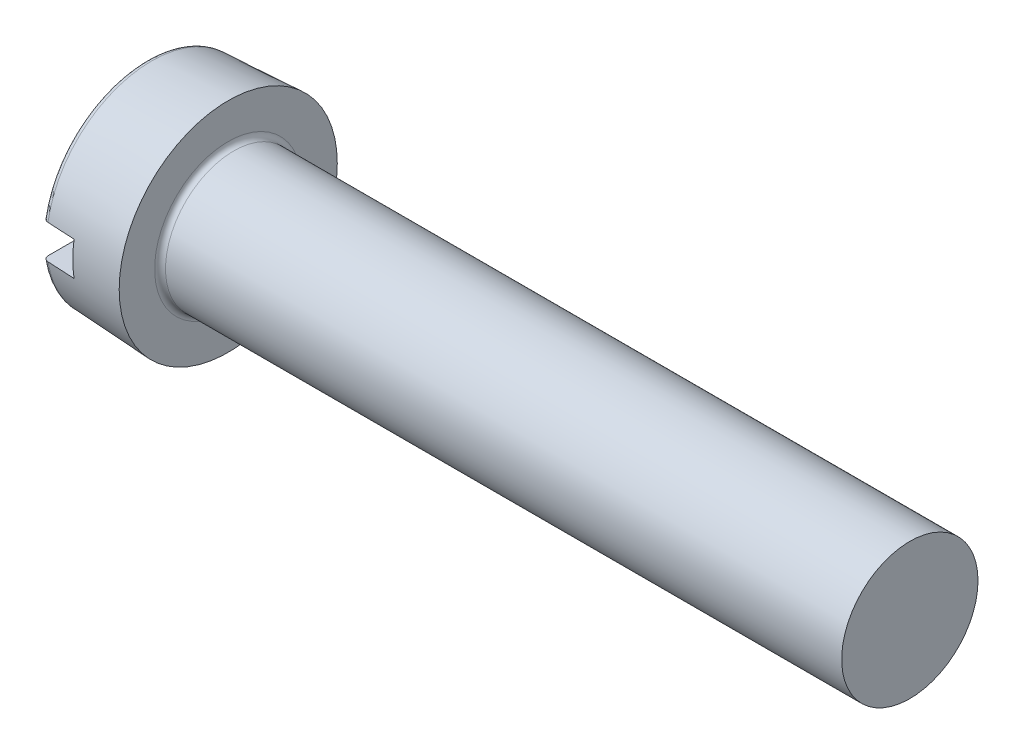
ISO-10303-21;
HEADER;
FILE_DESCRIPTION(('STEP AP214'),'2;1');
FILE_NAME('part.step','',(''),(''),'','','');
FILE_SCHEMA(('AUTOMOTIVE_DESIGN { 1 0 10303 214 1 1 1 1 }'));
ENDSEC;
DATA;
#1=APPLICATION_CONTEXT('core data for automotive mechanical design processes');
#2=APPLICATION_PROTOCOL_DEFINITION('international standard','automotive_design',2000,#1);
#3=PRODUCT_CONTEXT('',#1,'mechanical');
#4=PRODUCT('Part','Part','',(#3));
#5=PRODUCT_RELATED_PRODUCT_CATEGORY('part','',(#4));
#6=PRODUCT_DEFINITION_FORMATION('','',#4);
#7=PRODUCT_DEFINITION_CONTEXT('part definition',#1,'design');
#8=PRODUCT_DEFINITION('design','',#6,#7);
#9=PRODUCT_DEFINITION_SHAPE('','',#8);
#10=(LENGTH_UNIT() NAMED_UNIT(*) SI_UNIT(.MILLI.,.METRE.));
#11=(NAMED_UNIT(*) PLANE_ANGLE_UNIT() SI_UNIT($,.RADIAN.));
#12=(NAMED_UNIT(*) SI_UNIT($,.STERADIAN.) SOLID_ANGLE_UNIT());
#13=UNCERTAINTY_MEASURE_WITH_UNIT(LENGTH_MEASURE(1.E-05),#10,'distance_accuracy_value','');
#14=(GEOMETRIC_REPRESENTATION_CONTEXT(3) GLOBAL_UNCERTAINTY_ASSIGNED_CONTEXT((#13)) GLOBAL_UNIT_ASSIGNED_CONTEXT((#10,
#11,#12)) REPRESENTATION_CONTEXT('',''));
#15=CARTESIAN_POINT('',(0.,0.,0.));
#16=DIRECTION('',(0.,0.,1.));
#17=DIRECTION('',(1.,0.,0.));
#18=AXIS2_PLACEMENT_3D('',#15,#16,#17);
#19=CARTESIAN_POINT('',(-5.68076434205211,-1.62548997138856,2.70142219270042));
#20=DIRECTION('',(1.,0.,0.));
#21=DIRECTION('',(0.,0.,-1.));
#22=AXIS2_PLACEMENT_3D('',#19,#20,#21);
#23=PLANE('',#22);
#24=DIRECTION('',(0.,0.,-1.));
#25=VECTOR('',#24,1.);
#26=CARTESIAN_POINT('',(-5.68076434205211,-2.87548997138856,2.70142219270042));
#27=LINE('',#26,#25);
#28=CARTESIAN_POINT('',(-5.68076434205211,-2.87548997138856,9.89966233013808));
#29=VERTEX_POINT('',#28);
#30=CARTESIAN_POINT('',(-5.68076434205211,-2.87548997138856,-4.49681794473724));
#31=VERTEX_POINT('',#30);
#32=EDGE_CURVE('E96',#29,#31,#27,.T.);
#33=ORIENTED_EDGE('',*,*,#32,.T.);
#34=CARTESIAN_POINT('',(-5.68076434205211,-1.62548997138856,2.70142219270042));
#35=DIRECTION('',(1.,0.,0.));
#36=DIRECTION('',(0.,0.,-1.));
#37=AXIS2_PLACEMENT_3D('',#34,#35,#36);
#38=CIRCLE('',#37,7.3059674976158);
#39=EDGE_CURVE('E184',#31,#29,#38,.F.);
#40=ORIENTED_EDGE('',*,*,#39,.T.);
#41=EDGE_LOOP('',(#33,#40));
#42=FACE_BOUND('',#41,.T.);
#43=ADVANCED_FACE('F16',(#42),#23,.F.);
#44=CARTESIAN_POINT('',(0.319235657947887,-1.62548997138856,2.70142219270042));
#45=DIRECTION('',(1.,0.,0.));
#46=DIRECTION('',(0.,0.,-1.));
#47=AXIS2_PLACEMENT_3D('',#44,#45,#46);
#48=PLANE('',#47);
#49=CARTESIAN_POINT('',(0.319235657947887,-1.62548997138856,2.70142219270042));
#50=DIRECTION('',(1.,0.,0.));
#51=DIRECTION('',(0.,0.,-1.));
#52=AXIS2_PLACEMENT_3D('',#49,#50,#51);
#53=CIRCLE('',#52,5.4);
#54=CARTESIAN_POINT('',(0.319235657947887,-1.62548997138856,-2.69857780729958));
#55=VERTEX_POINT('',#54);
#56=EDGE_CURVE('E106',#55,#55,#53,.F.);
#57=ORIENTED_EDGE('',*,*,#56,.T.);
#58=EDGE_LOOP('',(#57));
#59=FACE_BOUND('',#58,.T.);
#60=CARTESIAN_POINT('',(0.319235657947887,-1.62548997138856,2.70142219270042));
#61=DIRECTION('',(1.,0.,0.));
#62=DIRECTION('',(0.,0.,-1.));
#63=AXIS2_PLACEMENT_3D('',#60,#61,#62);
#64=CIRCLE('',#63,8.);
#65=CARTESIAN_POINT('',(0.319235657947887,-1.62548997138856,-5.29857780729958));
#66=VERTEX_POINT('',#65);
#67=EDGE_CURVE('E213',#66,#66,#64,.T.);
#68=ORIENTED_EDGE('',*,*,#67,.T.);
#69=EDGE_LOOP('',(#68));
#70=FACE_BOUND('',#69,.T.);
#71=ADVANCED_FACE('F157',(#59,#70),#48,.T.);
#72=CARTESIAN_POINT('',(0.319235657947887,-1.62548997138856,2.70142219270042));
#73=DIRECTION('',(1.,0.,0.));
#74=DIRECTION('',(0.,0.,-1.));
#75=AXIS2_PLACEMENT_3D('',#72,#73,#74);
#76=CONICAL_SURFACE('',#75,8.,0.05235987755983);
#77=CARTESIAN_POINT('',(-19.2653061007865,-2.87548997138856,9.56209586531042));
#78=CARTESIAN_POINT('',(-16.8158751824795,-2.87548997138856,9.69257714206704));
#79=CARTESIAN_POINT('',(-14.3664380480004,-2.87548997138856,9.82294167347964));
#80=CARTESIAN_POINT('',(-9.46755301818584,-2.87548997138856,10.083468164128));
#81=CARTESIAN_POINT('',(-7.0181051228504,-2.87548997138856,10.2136301233648));
#82=CARTESIAN_POINT('',(-2.11920022133507,-2.87548997138856,10.4737823893166));
#83=CARTESIAN_POINT('',(0.330256784844802,-2.87548997138856,10.6037726960318));
#84=CARTESIAN_POINT('',(5.22917871232099,-2.87548997138856,10.8636043159814));
#85=CARTESIAN_POINT('',(7.67864363361735,-2.87548997138856,10.9934456292149));
#86=CARTESIAN_POINT('',(10.1281119004095,-2.87548997138856,11.1232237744742));
#87=B_SPLINE_CURVE_WITH_KNOTS('',3,(#77,#78,#79,#80,#81,#82,#83,#84,#85,#86),.UNSPECIFIED.,.F.,
.F.,(4,2,2,2,4),(0.,7.35871147572517,14.7174229139558,22.0761343417157,29.4348458068954),.UNSPECIFIED.);
#88=CARTESIAN_POINT('',(-5.30169872454929,-2.87548997138856,10.3047758452875));
#89=VERTEX_POINT('',#88);
#90=CARTESIAN_POINT('',(-3.28076434205211,-2.87548997138856,10.412090615708));
#91=VERTEX_POINT('',#90);
#92=EDGE_CURVE('E80',#89,#91,#87,.T.);
#93=ORIENTED_EDGE('',*,*,#92,.F.);
#94=CARTESIAN_POINT('',(-5.30169872454929,-1.62548997138856,2.70142219270042));
#95=DIRECTION('',(1.,0.,0.));
#96=DIRECTION('',(0.,0.,-1.));
#97=AXIS2_PLACEMENT_3D('',#94,#95,#96);
#98=CIRCLE('',#97,7.70541931151763);
#99=CARTESIAN_POINT('',(-5.30169872454929,-2.87548997138856,-4.90193145988664));
#100=VERTEX_POINT('',#99);
#101=EDGE_CURVE('E112',#89,#100,#98,.T.);
#102=ORIENTED_EDGE('',*,*,#101,.T.);
#103=CARTESIAN_POINT('',(10.1281119004095,-2.87548997138856,-5.72037938907336));
#104=CARTESIAN_POINT('',(7.67864363361735,-2.87548997138856,-5.59060124381403));
#105=CARTESIAN_POINT('',(5.22917871232099,-2.87548997138856,-5.46075993058053));
#106=CARTESIAN_POINT('',(0.3302567848448,-2.87548997138856,-5.200928310631));
#107=CARTESIAN_POINT('',(-2.11920022133507,-2.87548997138856,-5.07093800391572));
#108=CARTESIAN_POINT('',(-7.0181051228504,-2.87548997138856,-4.81078573796391));
#109=CARTESIAN_POINT('',(-9.46755301818584,-2.87548997138856,-4.68062377872714));
#110=CARTESIAN_POINT('',(-14.3664380480004,-2.87548997138856,-4.4200972880788));
#111=CARTESIAN_POINT('',(-16.8158751824795,-2.87548997138856,-4.2897327566662));
#112=CARTESIAN_POINT('',(-19.2653061007865,-2.87548997138856,-4.15925147990958));
#113=B_SPLINE_CURVE_WITH_KNOTS('',3,(#103,#104,#105,#106,#107,#108,#109,#110,#111,#112),
.UNSPECIFIED.,.F.,.F.,(4,2,2,2,4),(0.,7.35871146517972,14.7174228929396,22.0761343311703,
29.4348458068954),.UNSPECIFIED.);
#114=CARTESIAN_POINT('',(-3.28076434205211,-2.87548997138856,-5.00924623030712));
#115=VERTEX_POINT('',#114);
#116=EDGE_CURVE('E92',#115,#100,#113,.T.);
#117=ORIENTED_EDGE('',*,*,#116,.F.);
#118=CARTESIAN_POINT('',(-3.28076434205211,-1.62548997138856,2.70142219270042));
#119=DIRECTION('',(1.,0.,0.));
#120=DIRECTION('',(0.,0.,-1.));
#121=AXIS2_PLACEMENT_3D('',#118,#119,#120);
#122=CIRCLE('',#121,7.81133199458105);
#123=CARTESIAN_POINT('',(-3.28076434205211,-0.375489971388559,-5.00924623030712));
#124=VERTEX_POINT('',#123);
#125=EDGE_CURVE('E84',#124,#115,#122,.F.);
#126=ORIENTED_EDGE('',*,*,#125,.F.);
#127=CARTESIAN_POINT('',(-19.2653061007865,-0.375489971388567,-4.15925147990958));
#128=CARTESIAN_POINT('',(-16.8158751824795,-0.375489971388566,-4.2897327566662));
#129=CARTESIAN_POINT('',(-14.3664380480004,-0.375489971388565,-4.42009728807881));
#130=CARTESIAN_POINT('',(-9.46755301818584,-0.375489971388562,-4.68062377872714));
#131=CARTESIAN_POINT('',(-7.0181051228504,-0.375489971388561,-4.81078573796391));
#132=CARTESIAN_POINT('',(-2.11920022133507,-0.375489971388558,-5.07093800391572));
#133=CARTESIAN_POINT('',(0.3302567848448,-0.375489971388557,-5.200928310631));
#134=CARTESIAN_POINT('',(5.229178712321,-0.375489971388554,-5.46075993058053));
#135=CARTESIAN_POINT('',(7.67864363361736,-0.375489971388553,-5.59060124381403));
#136=CARTESIAN_POINT('',(10.1281119004095,-0.375489971388551,-5.72037938907336));
#137=B_SPLINE_CURVE_WITH_KNOTS('',3,(#127,#128,#129,#130,#131,#132,#133,#134,#135,#136),
.UNSPECIFIED.,.F.,.F.,(4,2,2,2,4),(0.,7.35871147572517,14.7174229139558,22.0761343417157,
29.4348458068954),.UNSPECIFIED.);
#138=CARTESIAN_POINT('',(-5.30169872454929,-0.37548997138856,-4.90193145988664));
#139=VERTEX_POINT('',#138);
#140=EDGE_CURVE('E68',#139,#124,#137,.T.);
#141=ORIENTED_EDGE('',*,*,#140,.F.);
#142=CARTESIAN_POINT('',(-5.30169872454929,-1.62548997138856,2.70142219270042));
#143=DIRECTION('',(1.,0.,0.));
#144=DIRECTION('',(0.,0.,-1.));
#145=AXIS2_PLACEMENT_3D('',#142,#143,#144);
#146=CIRCLE('',#145,7.70541931151763);
#147=CARTESIAN_POINT('',(-5.30169872454929,-0.37548997138856,10.3047758452875));
#148=VERTEX_POINT('',#147);
#149=EDGE_CURVE('E108',#139,#148,#146,.T.);
#150=ORIENTED_EDGE('',*,*,#149,.T.);
#151=CARTESIAN_POINT('',(10.1281119004095,-0.375489971388551,11.1232237744742));
#152=CARTESIAN_POINT('',(7.67864363361735,-0.375489971388553,10.9934456292149));
#153=CARTESIAN_POINT('',(5.22917871232099,-0.375489971388554,10.8636043159814));
#154=CARTESIAN_POINT('',(0.3302567848448,-0.375489971388557,10.6037726960318));
#155=CARTESIAN_POINT('',(-2.11920022133507,-0.375489971388558,10.4737823893166));
#156=CARTESIAN_POINT('',(-7.0181051228504,-0.375489971388561,10.2136301233648));
#157=CARTESIAN_POINT('',(-9.46755301818584,-0.375489971388562,10.083468164128));
#158=CARTESIAN_POINT('',(-14.3664380480004,-0.375489971388565,9.82294167347965));
#159=CARTESIAN_POINT('',(-16.8158751824795,-0.375489971388566,9.69257714206704));
#160=CARTESIAN_POINT('',(-19.2653061007865,-0.375489971388567,9.56209586531042));
#161=B_SPLINE_CURVE_WITH_KNOTS('',3,(#151,#152,#153,#154,#155,#156,#157,#158,#159,#160),
.UNSPECIFIED.,.F.,.F.,(4,2,2,2,4),(0.,7.35871146517972,14.7174228929396,22.0761343311703,
29.4348458068954),.UNSPECIFIED.);
#162=CARTESIAN_POINT('',(-3.28076434205211,-0.375489971388559,10.412090615708));
#163=VERTEX_POINT('',#162);
#164=EDGE_CURVE('E77',#163,#148,#161,.T.);
#165=ORIENTED_EDGE('',*,*,#164,.F.);
#166=EDGE_CURVE('E88',#91,#163,#122,.F.);
#167=ORIENTED_EDGE('',*,*,#166,.F.);
#168=EDGE_LOOP('',(#93,#102,#117,#126,#141,#150,#165,#167));
#169=FACE_BOUND('',#168,.T.);
#170=ORIENTED_EDGE('',*,*,#67,.F.);
#171=EDGE_LOOP('',(#170));
#172=FACE_BOUND('',#171,.T.);
#173=ADVANCED_FACE('F93',(#169,#172),#76,.T.);
#174=DIRECTION('',(0.,0.,1.));
#175=VECTOR('',#174,1.);
#176=CARTESIAN_POINT('',(-5.68076434205211,-0.37548997138856,2.70142219270042));
#177=LINE('',#176,#175);
#178=CARTESIAN_POINT('',(-5.68076434205211,-0.37548997138856,-4.49681794473724));
#179=VERTEX_POINT('',#178);
#180=CARTESIAN_POINT('',(-5.68076434205211,-0.37548997138856,9.89966233013808));
#181=VERTEX_POINT('',#180);
#182=EDGE_CURVE('E99',#179,#181,#177,.T.);
#183=ORIENTED_EDGE('',*,*,#182,.T.);
#184=CARTESIAN_POINT('',(-5.68076434205211,-1.62548997138856,2.70142219270042));
#185=DIRECTION('',(1.,0.,0.));
#186=DIRECTION('',(0.,0.,-1.));
#187=AXIS2_PLACEMENT_3D('',#184,#185,#186);
#188=CIRCLE('',#187,7.3059674976158);
#189=EDGE_CURVE('E10',#181,#179,#188,.F.);
#190=ORIENTED_EDGE('',*,*,#189,.T.);
#191=EDGE_LOOP('',(#183,#190));
#192=FACE_BOUND('',#191,.T.);
#193=ADVANCED_FACE('F158',(#192),#23,.F.);
#194=CARTESIAN_POINT('',(50.319235657857,-1.62548997138856,2.70142219270042));
#195=DIRECTION('',(-1.,0.,0.));
#196=DIRECTION('',(0.,0.,1.));
#197=AXIS2_PLACEMENT_3D('',#194,#195,#196);
#198=CYLINDRICAL_SURFACE('',#197,5.);
#199=CARTESIAN_POINT('',(0.71923565794789,-1.62548997138856,2.70142219270042));
#200=DIRECTION('',(1.,0.,0.));
#201=DIRECTION('',(0.,0.,-1.));
#202=AXIS2_PLACEMENT_3D('',#199,#200,#201);
#203=CIRCLE('',#202,5.);
#204=CARTESIAN_POINT('',(0.71923565794789,-1.62548997138856,-2.29857780729958));
#205=VERTEX_POINT('',#204);
#206=EDGE_CURVE('E98',#205,#205,#203,.T.);
#207=ORIENTED_EDGE('',*,*,#206,.T.);
#208=EDGE_LOOP('',(#207));
#209=FACE_BOUND('',#208,.T.);
#210=CARTESIAN_POINT('',(50.319235657857,-1.62548997138856,2.70142219270042));
#211=DIRECTION('',(1.,0.,0.));
#212=DIRECTION('',(0.,0.,-1.));
#213=AXIS2_PLACEMENT_3D('',#210,#211,#212);
#214=CIRCLE('',#213,5.);
#215=CARTESIAN_POINT('',(50.319235657857,-1.62548997138856,-2.29857780729958));
#216=VERTEX_POINT('',#215);
#217=EDGE_CURVE('E153',#216,#216,#214,.T.);
#218=ORIENTED_EDGE('',*,*,#217,.F.);
#219=EDGE_LOOP('',(#218));
#220=FACE_BOUND('',#219,.T.);
#221=ADVANCED_FACE('F208',(#209,#220),#198,.T.);
#222=CARTESIAN_POINT('',(50.319235657857,-1.62548997138856,2.70142219270042));
#223=DIRECTION('',(1.,0.,0.));
#224=DIRECTION('',(0.,0.,-1.));
#225=AXIS2_PLACEMENT_3D('',#222,#223,#224);
#226=PLANE('',#225);
#227=ORIENTED_EDGE('',*,*,#217,.T.);
#228=EDGE_LOOP('',(#227));
#229=FACE_BOUND('',#228,.T.);
#230=ADVANCED_FACE('F133',(#229),#226,.T.);
#231=CARTESIAN_POINT('',(-5.68076434205211,-2.87548997138856,-5.29857780729958));
#232=DIRECTION('',(0.,-1.,0.));
#233=DIRECTION('',(1.,0.,0.));
#234=AXIS2_PLACEMENT_3D('',#231,#232,#233);
#235=PLANE('',#234);
#236=ORIENTED_EDGE('',*,*,#116,.T.);
#237=CARTESIAN_POINT('',(-5.30169872454929,-2.87548997138856,-4.90193145988663));
#238=CARTESIAN_POINT('',(-5.32397658899489,-2.87548997138856,-4.90076853134963));
#239=CARTESIAN_POINT('',(-5.34614424691299,-2.87548997138856,-4.89767846366656));
#240=CARTESIAN_POINT('',(-5.38962400834501,-2.87548997138856,-4.88783228872694));
#241=CARTESIAN_POINT('',(-5.41093707549727,-2.87548997138856,-4.88108044291219));
#242=CARTESIAN_POINT('',(-5.45213390241985,-2.87548997138856,-4.86409258614218));
#243=CARTESIAN_POINT('',(-5.47201718670741,-2.87548997138856,-4.85385542255487));
#244=CARTESIAN_POINT('',(-5.50979538711333,-2.87548997138856,-4.83021128874185));
#245=CARTESIAN_POINT('',(-5.52769048812116,-2.87548997138856,-4.81680461362556));
#246=CARTESIAN_POINT('',(-5.56111586966896,-2.87548997138856,-4.78711800664787));
#247=CARTESIAN_POINT('',(-5.57663051203876,-2.87548997138856,-4.77082047453877));
#248=CARTESIAN_POINT('',(-5.60475005472905,-2.87548997138856,-4.73587627936154));
#249=CARTESIAN_POINT('',(-5.61735400993793,-2.87548997138856,-4.71722885630393));
#250=CARTESIAN_POINT('',(-5.63946751461055,-2.87548997138856,-4.67785596397625));
#251=CARTESIAN_POINT('',(-5.64893354629003,-2.87548997138856,-4.65710609407139));
#252=CARTESIAN_POINT('',(-5.66428887540118,-2.87548997138856,-4.61433203581689));
#253=CARTESIAN_POINT('',(-5.67018098395311,-2.87548997138856,-4.59230886397583));
#254=CARTESIAN_POINT('',(-5.67639668829817,-2.87548997138856,-4.55789374402389));
#255=CARTESIAN_POINT('',(-5.67803493552397,-2.87548997138856,-4.54572492780513));
#256=CARTESIAN_POINT('',(-5.68021782620474,-2.87548997138856,-4.52131178461762));
#257=CARTESIAN_POINT('',(-5.68076444404134,-2.87548997138856,-4.5090676342254));
#258=CARTESIAN_POINT('',(-5.68076434205221,-2.87548997138856,-4.49681794473725));
#259=B_SPLINE_CURVE_WITH_KNOTS('',3,(#237,#238,#239,#240,#241,#242,#243,#244,#245,#246,#247,
#248,#249,#250,#251,#252,#253,#254,#255,#256,#257,#258),.UNSPECIFIED.,.F.,.F.,(4,2,2,2,2,2,2,2,
2,2,4),(0.,0.0668313746306013,0.133585139755698,0.200361002547336,0.267130650365643,
0.334321708472481,0.401534553201093,0.469643928473144,0.53769966163764,0.574492120019076,
0.611217973028153),.UNSPECIFIED.);
#260=EDGE_CURVE('E120',#100,#31,#259,.T.);
#261=ORIENTED_EDGE('',*,*,#260,.T.);
#262=ORIENTED_EDGE('',*,*,#32,.F.);
#263=CARTESIAN_POINT('',(-5.68076434205211,-2.87548997138856,9.89966233013808));
#264=CARTESIAN_POINT('',(-5.68078245571232,-2.87548997138856,9.92272891751978));
#265=CARTESIAN_POINT('',(-5.6788285099749,-2.87548997138856,9.94579224876267));
#266=CARTESIAN_POINT('',(-5.6711037557665,-2.87548997138856,9.99126399804459));
#267=CARTESIAN_POINT('',(-5.66533408422335,-2.87548997138856,10.013672609087));
#268=CARTESIAN_POINT('',(-5.65009995111816,-2.87548997138856,10.0572154365966));
#269=CARTESIAN_POINT('',(-5.64063304479067,-2.87548997138856,10.0783487991192));
#270=CARTESIAN_POINT('',(-5.61826382448252,-2.87548997138856,10.1187034540116));
#271=CARTESIAN_POINT('',(-5.60536270994631,-2.87548997138856,10.1379254107527));
#272=CARTESIAN_POINT('',(-5.57658191604202,-2.87548997138856,10.1737583751217));
#273=CARTESIAN_POINT('',(-5.56072505446732,-2.87548997138856,10.1903877025082));
#274=CARTESIAN_POINT('',(-5.52640408921236,-2.87548997138856,10.2207096421876));
#275=CARTESIAN_POINT('',(-5.50793922921896,-2.87548997138856,10.2344013996807));
#276=CARTESIAN_POINT('',(-5.46919513949327,-2.87548997138856,10.2582595409048));
#277=CARTESIAN_POINT('',(-5.44894287615049,-2.87548997138856,10.2684697978818));
#278=CARTESIAN_POINT('',(-5.40700798154731,-2.87548997138856,10.2852884173398));
#279=CARTESIAN_POINT('',(-5.38532711292057,-2.87548997138856,10.2919011285737));
#280=CARTESIAN_POINT('',(-5.35312058946873,-2.87548997138856,10.2987831018485));
#281=CARTESIAN_POINT('',(-5.34289513600565,-2.87548997138856,10.3005494376175));
#282=CARTESIAN_POINT('',(-5.32235479728201,-2.87548997138856,10.3032703663495));
#283=CARTESIAN_POINT('',(-5.31204009744075,-2.87548997138856,10.304226358977));
#284=CARTESIAN_POINT('',(-5.30169872454929,-2.87548997138856,10.3047758452875));
#285=B_SPLINE_CURVE_WITH_KNOTS('',3,(#263,#264,#265,#266,#267,#268,#269,#270,#271,#272,#273,
#274,#275,#276,#277,#278,#279,#280,#281,#282,#283,#284),.UNSPECIFIED.,.F.,.F.,(4,2,2,2,2,2,2,2,
2,2,4),(0.,0.0691128770525089,0.138205170609641,0.207343228430405,0.276457170444669,
0.345058144130518,0.413679052933858,0.481400150321258,0.549039202773831,0.580142822445589,
0.611192608304175),.UNSPECIFIED.);
#286=EDGE_CURVE('E114',#29,#89,#285,.T.);
#287=ORIENTED_EDGE('',*,*,#286,.T.);
#288=ORIENTED_EDGE('',*,*,#92,.T.);
#289=DIRECTION('',(0.,0.,1.));
#290=VECTOR('',#289,1.);
#291=CARTESIAN_POINT('',(-3.28076434205211,-2.87548997138856,-5.29857780729958));
#292=LINE('',#291,#290);
#293=EDGE_CURVE('E87',#115,#91,#292,.T.);
#294=ORIENTED_EDGE('',*,*,#293,.F.);
#295=EDGE_LOOP('',(#236,#261,#262,#287,#288,#294));
#296=FACE_BOUND('',#295,.T.);
#297=ADVANCED_FACE('F127',(#296),#235,.F.);
#298=CARTESIAN_POINT('',(-5.68076434205211,-0.37548997138856,-5.29857780729958));
#299=DIRECTION('',(0.,1.,0.));
#300=DIRECTION('',(-1.,0.,0.));
#301=AXIS2_PLACEMENT_3D('',#298,#299,#300);
#302=PLANE('',#301);
#303=ORIENTED_EDGE('',*,*,#164,.T.);
#304=CARTESIAN_POINT('',(-5.30169872454929,-0.37548997138856,10.3047758452875));
#305=CARTESIAN_POINT('',(-5.32397658899489,-0.37548997138856,10.3036129167505));
#306=CARTESIAN_POINT('',(-5.34614424691299,-0.37548997138856,10.3005228490674));
#307=CARTESIAN_POINT('',(-5.38962400834501,-0.37548997138856,10.2906766741278));
#308=CARTESIAN_POINT('',(-5.41093707549727,-0.37548997138856,10.283924828313));
#309=CARTESIAN_POINT('',(-5.45213390241985,-0.37548997138856,10.266936971543));
#310=CARTESIAN_POINT('',(-5.47201718670741,-0.37548997138856,10.2566998079557));
#311=CARTESIAN_POINT('',(-5.50979538711333,-0.37548997138856,10.2330556741427));
#312=CARTESIAN_POINT('',(-5.52769048812116,-0.37548997138856,10.2196489990264));
#313=CARTESIAN_POINT('',(-5.56111586966896,-0.37548997138856,10.1899623920487));
#314=CARTESIAN_POINT('',(-5.57663051203876,-0.37548997138856,10.1736648599396));
#315=CARTESIAN_POINT('',(-5.60475005472905,-0.37548997138856,10.1387206647624));
#316=CARTESIAN_POINT('',(-5.61735400993793,-0.37548997138856,10.1200732417048));
#317=CARTESIAN_POINT('',(-5.63946751461055,-0.37548997138856,10.0807003493771));
#318=CARTESIAN_POINT('',(-5.64893354629003,-0.37548997138856,10.0599504794722));
#319=CARTESIAN_POINT('',(-5.66428887540118,-0.37548997138856,10.0171764212177));
#320=CARTESIAN_POINT('',(-5.67018098395311,-0.37548997138856,9.99515324937667));
#321=CARTESIAN_POINT('',(-5.67639668829817,-0.37548997138856,9.96073812942473));
#322=CARTESIAN_POINT('',(-5.67803493552397,-0.37548997138856,9.94856931320597));
#323=CARTESIAN_POINT('',(-5.68021782620474,-0.37548997138856,9.92415617001846));
#324=CARTESIAN_POINT('',(-5.68076444404134,-0.37548997138856,9.91191201962624));
#325=CARTESIAN_POINT('',(-5.68076434205221,-0.37548997138856,9.89966233013809));
#326=B_SPLINE_CURVE_WITH_KNOTS('',3,(#304,#305,#306,#307,#308,#309,#310,#311,#312,#313,#314,
#315,#316,#317,#318,#319,#320,#321,#322,#323,#324,#325),.UNSPECIFIED.,.F.,.F.,(4,2,2,2,2,2,2,2,
2,2,4),(0.,0.0668313746306012,0.133585139755698,0.200361002547336,0.267130650365644,
0.334321708472482,0.401534553201093,0.469643928473142,0.537699661637639,0.574492120019076,
0.611217973028153),.UNSPECIFIED.);
#327=EDGE_CURVE('E25',#148,#181,#326,.T.);
#328=ORIENTED_EDGE('',*,*,#327,.T.);
#329=ORIENTED_EDGE('',*,*,#182,.F.);
#330=CARTESIAN_POINT('',(-5.68076434205211,-0.37548997138856,-4.49681794473724));
#331=CARTESIAN_POINT('',(-5.68078245571231,-0.37548997138856,-4.51988453211894));
#332=CARTESIAN_POINT('',(-5.6788285099749,-0.37548997138856,-4.54294786336183));
#333=CARTESIAN_POINT('',(-5.6711037557665,-0.37548997138856,-4.58841961264375));
#334=CARTESIAN_POINT('',(-5.66533408422335,-0.37548997138856,-4.61082822368617));
#335=CARTESIAN_POINT('',(-5.65009995111816,-0.37548997138856,-4.65437105119581));
#336=CARTESIAN_POINT('',(-5.64063304479067,-0.37548997138856,-4.67550441371841));
#337=CARTESIAN_POINT('',(-5.61826382448253,-0.37548997138856,-4.71585906861073));
#338=CARTESIAN_POINT('',(-5.60536270994631,-0.37548997138856,-4.73508102535182));
#339=CARTESIAN_POINT('',(-5.57658191604202,-0.37548997138856,-4.7709139897209));
#340=CARTESIAN_POINT('',(-5.56072505446732,-0.37548997138856,-4.78754331710738));
#341=CARTESIAN_POINT('',(-5.52640408921236,-0.37548997138856,-4.81786525678674));
#342=CARTESIAN_POINT('',(-5.50793922921896,-0.37548997138856,-4.83155701427987));
#343=CARTESIAN_POINT('',(-5.46919513949327,-0.37548997138856,-4.85541515550395));
#344=CARTESIAN_POINT('',(-5.44894287615049,-0.37548997138856,-4.86562541248093));
#345=CARTESIAN_POINT('',(-5.40700798154731,-0.37548997138856,-4.88244403193893));
#346=CARTESIAN_POINT('',(-5.38532711292057,-0.37548997138856,-4.88905674317282));
#347=CARTESIAN_POINT('',(-5.35312058946873,-0.37548997138856,-4.8959387164477));
#348=CARTESIAN_POINT('',(-5.34289513600565,-0.37548997138856,-4.89770505221668));
#349=CARTESIAN_POINT('',(-5.32235479728201,-0.37548997138856,-4.90042598094864));
#350=CARTESIAN_POINT('',(-5.31204009744075,-0.37548997138856,-4.90138197357612));
#351=CARTESIAN_POINT('',(-5.30169872454929,-0.37548997138856,-4.90193145988665));
#352=B_SPLINE_CURVE_WITH_KNOTS('',3,(#330,#331,#332,#333,#334,#335,#336,#337,#338,#339,#340,
#341,#342,#343,#344,#345,#346,#347,#348,#349,#350,#351),.UNSPECIFIED.,.F.,.F.,(4,2,2,2,2,2,2,2,
2,2,4),(0.,0.069112877052508,0.13820517060964,0.207343228430404,0.276457170444668,
0.345058144130518,0.413679052933858,0.481400150321259,0.549039202773831,0.580142822445589,
0.611192608304176),.UNSPECIFIED.);
#353=EDGE_CURVE('E71',#179,#139,#352,.T.);
#354=ORIENTED_EDGE('',*,*,#353,.T.);
#355=ORIENTED_EDGE('',*,*,#140,.T.);
#356=DIRECTION('',(0.,0.,1.));
#357=VECTOR('',#356,1.);
#358=CARTESIAN_POINT('',(-3.28076434205211,-0.375489971388559,-5.29857780729958));
#359=LINE('',#358,#357);
#360=EDGE_CURVE('E70',#124,#163,#359,.T.);
#361=ORIENTED_EDGE('',*,*,#360,.T.);
#362=EDGE_LOOP('',(#303,#328,#329,#354,#355,#361));
#363=FACE_BOUND('',#362,.T.);
#364=ADVANCED_FACE('F67',(#363),#302,.F.);
#365=CARTESIAN_POINT('',(-3.28076434205211,-2.87548997138856,-5.29857780729958));
#366=DIRECTION('',(1.,0.,0.));
#367=DIRECTION('',(0.,0.,-1.));
#368=AXIS2_PLACEMENT_3D('',#365,#366,#367);
#369=PLANE('',#368);
#370=ORIENTED_EDGE('',*,*,#166,.T.);
#371=ORIENTED_EDGE('',*,*,#360,.F.);
#372=ORIENTED_EDGE('',*,*,#125,.T.);
#373=ORIENTED_EDGE('',*,*,#293,.T.);
#374=EDGE_LOOP('',(#370,#371,#372,#373));
#375=FACE_BOUND('',#374,.T.);
#376=ADVANCED_FACE('F82',(#375),#369,.F.);
#377=CARTESIAN_POINT('',(0.71923565794789,-1.62548997138856,2.70142219270042));
#378=DIRECTION('',(1.,0.,0.));
#379=DIRECTION('',(0.,0.,-1.));
#380=AXIS2_PLACEMENT_3D('',#377,#378,#379);
#381=TOROIDAL_SURFACE('',#380,5.4,0.4);
#382=ORIENTED_EDGE('',*,*,#56,.F.);
#383=EDGE_LOOP('',(#382));
#384=FACE_BOUND('',#383,.T.);
#385=ORIENTED_EDGE('',*,*,#206,.F.);
#386=EDGE_LOOP('',(#385));
#387=FACE_BOUND('',#386,.T.);
#388=ADVANCED_FACE('F161',(#384,#387),#381,.F.);
#389=CARTESIAN_POINT('',(-5.28076434205211,-1.62548997138856,2.70142219270042));
#390=DIRECTION('',(1.,0.,0.));
#391=DIRECTION('',(0.,0.,-1.));
#392=AXIS2_PLACEMENT_3D('',#389,#390,#391);
#393=TOROIDAL_SURFACE('',#392,7.3059674976158,0.4);
#394=ORIENTED_EDGE('',*,*,#286,.F.);
#395=ORIENTED_EDGE('',*,*,#39,.F.);
#396=ORIENTED_EDGE('',*,*,#260,.F.);
#397=ORIENTED_EDGE('',*,*,#101,.F.);
#398=EDGE_LOOP('',(#394,#395,#396,#397));
#399=FACE_BOUND('',#398,.T.);
#400=ADVANCED_FACE('F130',(#399),#393,.T.);
#401=CARTESIAN_POINT('',(-5.28076434205211,-1.62548997138856,2.70142219270042));
#402=DIRECTION('',(1.,0.,0.));
#403=DIRECTION('',(0.,0.,-1.));
#404=AXIS2_PLACEMENT_3D('',#401,#402,#403);
#405=TOROIDAL_SURFACE('',#404,7.3059674976158,0.4);
#406=ORIENTED_EDGE('',*,*,#353,.F.);
#407=ORIENTED_EDGE('',*,*,#189,.F.);
#408=ORIENTED_EDGE('',*,*,#327,.F.);
#409=ORIENTED_EDGE('',*,*,#149,.F.);
#410=EDGE_LOOP('',(#406,#407,#408,#409));
#411=FACE_BOUND('',#410,.T.);
#412=ADVANCED_FACE('F18',(#411),#405,.T.);
#413=CLOSED_SHELL('',(#43,#71,#173,#193,#221,#230,#297,#364,#376,#388,#400,#412));
#414=MANIFOLD_SOLID_BREP('B1',#413);
#415=ADVANCED_BREP_SHAPE_REPRESENTATION('',(#18,#414),#14);
#416=SHAPE_DEFINITION_REPRESENTATION(#9,#415);
ENDSEC;
END-ISO-10303-21;
